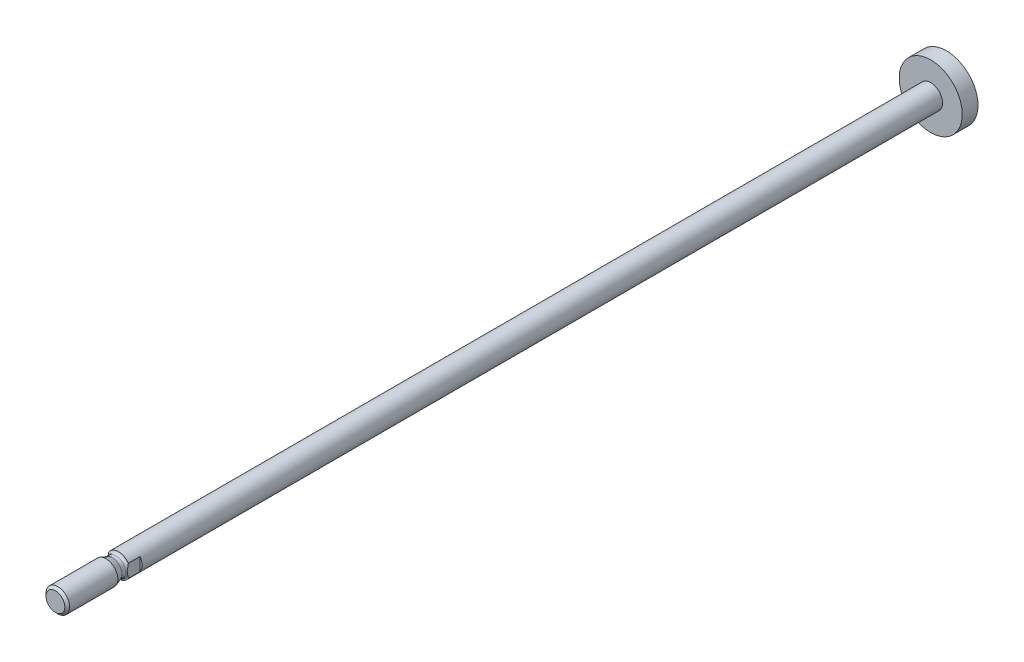
ISO-10303-21;
HEADER;
FILE_DESCRIPTION(('STEP AP214'),'2;1');
FILE_NAME('part.step','',(''),(''),'','','');
FILE_SCHEMA(('AUTOMOTIVE_DESIGN { 1 0 10303 214 1 1 1 1 }'));
ENDSEC;
DATA;
#1=APPLICATION_CONTEXT('core data for automotive mechanical design processes');
#2=APPLICATION_PROTOCOL_DEFINITION('international standard','automotive_design',2000,#1);
#3=PRODUCT_CONTEXT('',#1,'mechanical');
#4=PRODUCT('Part','Part','',(#3));
#5=PRODUCT_RELATED_PRODUCT_CATEGORY('part','',(#4));
#6=PRODUCT_DEFINITION_FORMATION('','',#4);
#7=PRODUCT_DEFINITION_CONTEXT('part definition',#1,'design');
#8=PRODUCT_DEFINITION('design','',#6,#7);
#9=PRODUCT_DEFINITION_SHAPE('','',#8);
#10=(LENGTH_UNIT() NAMED_UNIT(*) SI_UNIT(.MILLI.,.METRE.));
#11=(NAMED_UNIT(*) PLANE_ANGLE_UNIT() SI_UNIT($,.RADIAN.));
#12=(NAMED_UNIT(*) SI_UNIT($,.STERADIAN.) SOLID_ANGLE_UNIT());
#13=UNCERTAINTY_MEASURE_WITH_UNIT(LENGTH_MEASURE(1.E-05),#10,'distance_accuracy_value','');
#14=(GEOMETRIC_REPRESENTATION_CONTEXT(3) GLOBAL_UNCERTAINTY_ASSIGNED_CONTEXT((#13)) GLOBAL_UNIT_ASSIGNED_CONTEXT((#10,
#11,#12)) REPRESENTATION_CONTEXT('',''));
#15=CARTESIAN_POINT('',(0.,0.,0.));
#16=DIRECTION('',(0.,0.,1.));
#17=DIRECTION('',(1.,0.,0.));
#18=AXIS2_PLACEMENT_3D('',#15,#16,#17);
#19=CARTESIAN_POINT('',(0.,0.,-205.2));
#20=DIRECTION('',(0.,0.,1.));
#21=DIRECTION('',(1.,0.,0.));
#22=AXIS2_PLACEMENT_3D('',#19,#20,#21);
#23=CYLINDRICAL_SURFACE('',#22,3.);
#24=CARTESIAN_POINT('',(0.,0.,-201.2));
#25=DIRECTION('',(0.,0.,1.));
#26=DIRECTION('',(1.,0.,0.));
#27=AXIS2_PLACEMENT_3D('',#24,#25,#26);
#28=CIRCLE('',#27,3.);
#29=CARTESIAN_POINT('',(3.,0.,-201.2));
#30=VERTEX_POINT('',#29);
#31=EDGE_CURVE('E123',#30,#30,#28,.T.);
#32=ORIENTED_EDGE('',*,*,#31,.T.);
#33=EDGE_LOOP('',(#32));
#34=FACE_BOUND('',#33,.T.);
#35=DIRECTION('',(0.,0.,1.));
#36=VECTOR('',#35,1.);
#37=CARTESIAN_POINT('',(-2.5,-1.6583123951777,-205.2));
#38=LINE('',#37,#36);
#39=CARTESIAN_POINT('',(-2.5,-1.6583123951777,2.));
#40=VERTEX_POINT('',#39);
#41=CARTESIAN_POINT('',(-2.5,-1.6583123951777,5.));
#42=VERTEX_POINT('',#41);
#43=EDGE_CURVE('E53',#40,#42,#38,.T.);
#44=ORIENTED_EDGE('',*,*,#43,.F.);
#45=CARTESIAN_POINT('',(0.,0.,2.));
#46=DIRECTION('',(0.,0.,1.));
#47=DIRECTION('',(1.,0.,0.));
#48=AXIS2_PLACEMENT_3D('',#45,#46,#47);
#49=CIRCLE('',#48,3.);
#50=CARTESIAN_POINT('',(-2.5,1.6583123951777,2.));
#51=VERTEX_POINT('',#50);
#52=EDGE_CURVE('E11',#51,#40,#49,.T.);
#53=ORIENTED_EDGE('',*,*,#52,.F.);
#54=DIRECTION('',(0.,0.,1.));
#55=VECTOR('',#54,1.);
#56=CARTESIAN_POINT('',(-2.5,1.6583123951777,-205.2));
#57=LINE('',#56,#55);
#58=CARTESIAN_POINT('',(-2.5,1.65831239517778,4.99999999999909));
#59=VERTEX_POINT('',#58);
#60=EDGE_CURVE('E93',#59,#51,#57,.F.);
#61=ORIENTED_EDGE('',*,*,#60,.F.);
#62=CARTESIAN_POINT('',(0.,0.,5.));
#63=DIRECTION('',(0.,0.,1.));
#64=DIRECTION('',(1.,0.,0.));
#65=AXIS2_PLACEMENT_3D('',#62,#63,#64);
#66=CIRCLE('',#65,3.);
#67=CARTESIAN_POINT('',(2.5,1.6583123951777,5.));
#68=VERTEX_POINT('',#67);
#69=EDGE_CURVE('E92',#68,#59,#66,.T.);
#70=ORIENTED_EDGE('',*,*,#69,.F.);
#71=DIRECTION('',(0.,0.,1.));
#72=VECTOR('',#71,1.);
#73=CARTESIAN_POINT('',(2.5,1.6583123951777,-205.2));
#74=LINE('',#73,#72);
#75=CARTESIAN_POINT('',(2.5,1.6583123951777,2.));
#76=VERTEX_POINT('',#75);
#77=EDGE_CURVE('E61',#76,#68,#74,.T.);
#78=ORIENTED_EDGE('',*,*,#77,.F.);
#79=CARTESIAN_POINT('',(2.5,-1.6583123951777,2.));
#80=VERTEX_POINT('',#79);
#81=EDGE_CURVE('E42',#80,#76,#49,.T.);
#82=ORIENTED_EDGE('',*,*,#81,.F.);
#83=DIRECTION('',(0.,0.,1.));
#84=VECTOR('',#83,1.);
#85=CARTESIAN_POINT('',(2.5,-1.6583123951777,-205.2));
#86=LINE('',#85,#84);
#87=CARTESIAN_POINT('',(2.5,-1.65831239517778,4.99999999999909));
#88=VERTEX_POINT('',#87);
#89=EDGE_CURVE('E86',#88,#80,#86,.F.);
#90=ORIENTED_EDGE('',*,*,#89,.F.);
#91=EDGE_CURVE('E126',#42,#88,#66,.T.);
#92=ORIENTED_EDGE('',*,*,#91,.F.);
#93=EDGE_LOOP('',(#44,#53,#61,#70,#78,#82,#90,#92));
#94=FACE_BOUND('',#93,.T.);
#95=ADVANCED_FACE('F39',(#34,#94),#23,.T.);
#96=CARTESIAN_POINT('',(0.,0.,5.6000000000001));
#97=DIRECTION('',(0.,0.,1.));
#98=DIRECTION('',(1.,0.,0.));
#99=AXIS2_PLACEMENT_3D('',#96,#97,#98);
#100=TOROIDAL_SURFACE('',#99,3.0000000000001,0.600000000000099);
#101=CARTESIAN_POINT('',(0.,0.,5.6));
#102=DIRECTION('',(0.,0.,1.));
#103=DIRECTION('',(1.,0.,0.));
#104=AXIS2_PLACEMENT_3D('',#101,#102,#103);
#105=CIRCLE('',#104,2.4);
#106=CARTESIAN_POINT('',(2.4,0.,5.6));
#107=VERTEX_POINT('',#106);
#108=EDGE_CURVE('E114',#107,#107,#105,.T.);
#109=ORIENTED_EDGE('',*,*,#108,.F.);
#110=EDGE_LOOP('',(#109));
#111=FACE_BOUND('',#110,.T.);
#112=CARTESIAN_POINT('',(-2.5,0.,5.26833752096453));
#113=CARTESIAN_POINT('',(-2.5,0.0507234426297441,5.26834839993848));
#114=CARTESIAN_POINT('',(-2.5,0.101441776799662,5.26596843791489));
#115=CARTESIAN_POINT('',(-2.5,0.202536067556288,5.2569952015163));
#116=CARTESIAN_POINT('',(-2.5,0.252911588949165,5.2503973212644));
#117=CARTESIAN_POINT('',(-2.5,0.35392632203634,5.23403658213965));
#118=CARTESIAN_POINT('',(-2.5,0.404557369480025,5.224225913585));
#119=CARTESIAN_POINT('',(-2.5,0.505400398866161,5.20278595137819));
#120=CARTESIAN_POINT('',(-2.5,0.555612509775304,5.1911572409283));
#121=CARTESIAN_POINT('',(-2.5,0.655655613826413,5.16721678219831));
#122=CARTESIAN_POINT('',(-2.5,0.705487327239528,5.15490798008948));
#123=CARTESIAN_POINT('',(-2.5,0.805181864056362,5.13041893752706));
#124=CARTESIAN_POINT('',(-2.5,0.855044688832192,5.11823870324147));
#125=CARTESIAN_POINT('',(-2.5,1.00507376125951,5.08293674920261));
#126=CARTESIAN_POINT('',(-2.5,1.1055660279648,5.06108488117838));
#127=CARTESIAN_POINT('',(-2.5,1.30645493621981,5.02592717471424));
#128=CARTESIAN_POINT('',(-2.5,1.40682678389803,5.01248870030289));
#129=CARTESIAN_POINT('',(-2.5,1.60840199518987,4.99838763017595));
#130=CARTESIAN_POINT('',(-2.5,1.70960094347028,4.99767823287719));
#131=CARTESIAN_POINT('',(-2.5,1.86622781794818,5.01106448653587));
#132=CARTESIAN_POINT('',(-2.5,1.92218137883188,5.01877622049858));
#133=CARTESIAN_POINT('',(-2.5,2.03285053262341,5.0413651074687));
#134=CARTESIAN_POINT('',(-2.5,2.08756307823151,5.05625824117348));
#135=CARTESIAN_POINT('',(-2.5,2.18328084843635,5.09083457513036));
#136=CARTESIAN_POINT('',(-2.5,2.22483950461237,5.10896465354793));
#137=CARTESIAN_POINT('',(-2.5,2.30459524648064,5.1515245306446));
#138=CARTESIAN_POINT('',(-2.5,2.34279989724468,5.17593963670877));
#139=CARTESIAN_POINT('',(-2.5,2.40362753966407,5.22361594487622));
#140=CARTESIAN_POINT('',(-2.5,2.42757076392253,5.24518752529637));
#141=CARTESIAN_POINT('',(-2.5,2.47175757689057,5.29185573262645));
#142=CARTESIAN_POINT('',(-2.5,2.49200531158724,5.31694835263777));
#143=CARTESIAN_POINT('',(-2.5,2.52468492158815,5.36594738678137));
#144=CARTESIAN_POINT('',(-2.5,2.53785643218482,5.38935828111803));
#145=CARTESIAN_POINT('',(-2.5,2.56013164913301,5.43805384411947));
#146=CARTESIAN_POINT('',(-2.5,2.56923737677398,5.46333757440499));
#147=CARTESIAN_POINT('',(-2.5,2.58283057049981,5.51527496834575));
#148=CARTESIAN_POINT('',(-2.5,2.58729356105886,5.54193512227162));
#149=CARTESIAN_POINT('',(-2.5,2.59118020467599,5.59561989324821));
#150=CARTESIAN_POINT('',(-2.5,2.5906054179438,5.62264439487102));
#151=CARTESIAN_POINT('',(-2.5,2.5847447911938,5.67371298536964));
#152=CARTESIAN_POINT('',(-2.5,2.57988467167735,5.69780754958458));
#153=CARTESIAN_POINT('',(-2.5,2.56633022368149,5.74488485425705));
#154=CARTESIAN_POINT('',(-2.5,2.55763543991684,5.76786746233366));
#155=CARTESIAN_POINT('',(-2.5,2.53647695281551,5.81308697753744));
#156=CARTESIAN_POINT('',(-2.5,2.52388217742275,5.83526203314746));
#157=CARTESIAN_POINT('',(-2.5,2.49565831542702,5.87756858678122));
#158=CARTESIAN_POINT('',(-2.5,2.4800283022487,5.897699457906));
#159=CARTESIAN_POINT('',(-2.5,2.4381803160609,5.94494905141413));
#160=CARTESIAN_POINT('',(-2.5,2.41048793322772,5.97076525046522));
#161=CARTESIAN_POINT('',(-2.5,2.35128940318857,6.01762864695372));
#162=CARTESIAN_POINT('',(-2.5,2.31977194494069,6.03866114436212));
#163=CARTESIAN_POINT('',(-2.5,2.23952256294481,6.08463351159361));
#164=CARTESIAN_POINT('',(-2.5,2.18939204577726,6.10711912432076));
#165=CARTESIAN_POINT('',(-2.5,2.086424206848,6.14398267826286));
#166=CARTESIAN_POINT('',(-2.5,2.03358928965091,6.15836768991921));
#167=CARTESIAN_POINT('',(-2.5,1.93599580204544,6.17849484994285));
#168=CARTESIAN_POINT('',(-2.5,1.89144834077192,6.18531116329585));
#169=CARTESIAN_POINT('',(-2.5,1.80189908033616,6.19505697557448));
#170=CARTESIAN_POINT('',(-2.5,1.75689686177072,6.19798247787778));
#171=CARTESIAN_POINT('',(-2.5,1.66646832286127,6.20053377831371));
#172=CARTESIAN_POINT('',(-2.5,1.6210413945456,6.20013412759755));
#173=CARTESIAN_POINT('',(-2.5,1.53034280767568,6.19650595241103));
#174=CARTESIAN_POINT('',(-2.5,1.48507106445849,6.1932793543307));
#175=CARTESIAN_POINT('',(-2.5,1.33918047559004,6.17906735223514));
#176=CARTESIAN_POINT('',(-2.5,1.23902345631669,6.16342028964884));
#177=CARTESIAN_POINT('',(-2.5,1.03994836030368,6.12508984420092));
#178=CARTESIAN_POINT('',(-2.5,0.941034235224376,6.10238806221333));
#179=CARTESIAN_POINT('',(-2.5,0.793509038998567,6.06677672186832));
#180=CARTESIAN_POINT('',(-2.5,0.7446863854637,6.054702575567));
#181=CARTESIAN_POINT('',(-2.5,0.646996290398524,6.030738686552));
#182=CARTESIAN_POINT('',(-2.5,0.598128851070118,6.0188489352388));
#183=CARTESIAN_POINT('',(-2.5,0.500334281886721,5.99617397742217));
#184=CARTESIAN_POINT('',(-2.5,0.451408146263369,5.98538460255591));
#185=CARTESIAN_POINT('',(-2.5,0.353119090508098,5.96594052833405));
#186=CARTESIAN_POINT('',(-2.5,0.303756196305667,5.95728570312374));
#187=CARTESIAN_POINT('',(-2.5,0.204122497966492,5.94328110899502));
#188=CARTESIAN_POINT('',(-2.5,0.153847567097064,5.93795905985694));
#189=CARTESIAN_POINT('',(-2.5,0.0530351286873156,5.93177082830429));
#190=CARTESIAN_POINT('',(-2.5,0.0024977994589948,5.930901937583));
#191=CARTESIAN_POINT('',(-2.5,-0.0985305210715612,5.93381110626722));
#192=CARTESIAN_POINT('',(-2.5,-0.14902123482016,5.93759813511376));
#193=CARTESIAN_POINT('',(-2.5,-0.249573888409545,5.94904126176878));
#194=CARTESIAN_POINT('',(-2.5,-0.299635458091892,5.95670041313862));
#195=CARTESIAN_POINT('',(-2.5,-0.399725252919972,5.97472154484855));
#196=CARTESIAN_POINT('',(-2.5,-0.449748880216866,5.98510788708088));
#197=CARTESIAN_POINT('',(-2.5,-0.549453617514231,6.00732659888942));
#198=CARTESIAN_POINT('',(-2.5,-0.599134785603654,6.01915871651809));
#199=CARTESIAN_POINT('',(-2.5,-0.698392421521691,6.04328051823731));
#200=CARTESIAN_POINT('',(-2.5,-0.747968869022546,6.05557028383309));
#201=CARTESIAN_POINT('',(-2.5,-0.84720464589227,6.07981009984425));
#202=CARTESIAN_POINT('',(-2.5,-0.896863971124109,6.0917601667094));
#203=CARTESIAN_POINT('',(-2.5,-0.975241469303783,6.10978478042876));
#204=CARTESIAN_POINT('',(-2.5,-1.00388150216564,6.11619624816889));
#205=CARTESIAN_POINT('',(-2.5,-1.06125902675178,6.12857195456169));
#206=CARTESIAN_POINT('',(-2.5,-1.08999652018277,6.13453618533974));
#207=CARTESIAN_POINT('',(-2.5,-1.14748265723325,6.1458846074232));
#208=CARTESIAN_POINT('',(-2.5,-1.17623091126653,6.15127075206469));
#209=CARTESIAN_POINT('',(-2.5,-1.23384312688132,6.16137594760793));
#210=CARTESIAN_POINT('',(-2.5,-1.26270708577413,6.16609501391968));
#211=CARTESIAN_POINT('',(-2.5,-1.34949136584038,6.17908804539659));
#212=CARTESIAN_POINT('',(-2.5,-1.40759592627029,6.18619616796949));
#213=CARTESIAN_POINT('',(-2.5,-1.52420669712544,6.19636423685649));
#214=CARTESIAN_POINT('',(-2.5,-1.58271310503325,6.1994220245478));
#215=CARTESIAN_POINT('',(-2.5,-1.70911532678372,6.20051114496721));
#216=CARTESIAN_POINT('',(-2.5,-1.77702602049488,6.19766666103081));
#217=CARTESIAN_POINT('',(-2.5,-1.912149147007,6.18315262249392));
#218=CARTESIAN_POINT('',(-2.5,-1.97936016975703,6.17146782027944));
#219=CARTESIAN_POINT('',(-2.5,-2.09293467910467,6.14162835403314));
#220=CARTESIAN_POINT('',(-2.5,-2.1399801193776,6.12611102431254));
#221=CARTESIAN_POINT('',(-2.5,-2.23116163556241,6.08815370009842));
#222=CARTESIAN_POINT('',(-2.5,-2.27530548479003,6.06573319994486));
#223=CARTESIAN_POINT('',(-2.5,-2.34660579555824,6.0206656653127));
#224=CARTESIAN_POINT('',(-2.5,-2.37498330055351,5.99995880382842));
#225=CARTESIAN_POINT('',(-2.5,-2.42818185419372,5.95435228802646));
#226=CARTESIAN_POINT('',(-2.5,-2.45300628498281,5.92945667074117));
#227=CARTESIAN_POINT('',(-2.5,-2.49337206402375,5.88080957286876));
#228=CARTESIAN_POINT('',(-2.5,-2.50977972671913,5.85778028891266));
#229=CARTESIAN_POINT('',(-2.5,-2.5385948801776,5.80932543735906));
#230=CARTESIAN_POINT('',(-2.5,-2.55100468980703,5.7839012699618));
#231=CARTESIAN_POINT('',(-2.5,-2.57111606880391,5.7310152189761));
#232=CARTESIAN_POINT('',(-2.5,-2.57878240755407,5.70353974708557));
#233=CARTESIAN_POINT('',(-2.5,-2.58865812747843,5.64762323062993));
#234=CARTESIAN_POINT('',(-2.5,-2.59087093912576,5.61918280447873));
#235=CARTESIAN_POINT('',(-2.5,-2.58974032110845,5.56589468768046));
#236=CARTESIAN_POINT('',(-2.5,-2.58704036062141,5.54103102121321));
#237=CARTESIAN_POINT('',(-2.5,-2.57748265423562,5.49212434637714));
#238=CARTESIAN_POINT('',(-2.5,-2.57062518368025,5.46808128377277));
#239=CARTESIAN_POINT('',(-2.5,-2.55318309970271,5.42147694109437));
#240=CARTESIAN_POINT('',(-2.5,-2.54260847384664,5.39891188066154));
#241=CARTESIAN_POINT('',(-2.5,-2.51826231502416,5.35558968714916));
#242=CARTESIAN_POINT('',(-2.5,-2.50448933519591,5.33483337816906));
#243=CARTESIAN_POINT('',(-2.5,-2.46797257111134,5.28708275256527));
#244=CARTESIAN_POINT('',(-2.5,-2.44388663659998,5.26111270404154));
#245=CARTESIAN_POINT('',(-2.5,-2.39183121173732,5.21341702762138));
#246=CARTESIAN_POINT('',(-2.5,-2.36385414462067,5.19169988455002));
#247=CARTESIAN_POINT('',(-2.5,-2.29309604385226,5.14424955817408));
#248=CARTESIAN_POINT('',(-2.5,-2.24896151787955,5.12054273771195));
#249=CARTESIAN_POINT('',(-2.5,-2.15755724893995,5.08032986787273));
#250=CARTESIAN_POINT('',(-2.5,-2.1102815253453,5.0638380357592));
#251=CARTESIAN_POINT('',(-2.5,-1.98539576167196,5.02901994971649));
#252=CARTESIAN_POINT('',(-2.5,-1.90647682078743,5.01544295171964));
#253=CARTESIAN_POINT('',(-2.5,-1.74768813149434,5.00017484346382));
#254=CARTESIAN_POINT('',(-2.5,-1.66781762927049,4.99849388464395));
#255=CARTESIAN_POINT('',(-2.5,-1.45429321635247,5.00579419289827));
#256=CARTESIAN_POINT('',(-2.5,-1.32097329964418,5.02279704607492));
#257=CARTESIAN_POINT('',(-2.5,-1.12273292987174,5.05843900515103));
#258=CARTESIAN_POINT('',(-2.5,-1.05669317759064,5.07208123732001));
#259=CARTESIAN_POINT('',(-2.5,-0.925080173294097,5.10144856377507));
#260=CARTESIAN_POINT('',(-2.5,-0.85950678696237,5.11717303045709));
#261=CARTESIAN_POINT('',(-2.5,-0.728157455724953,5.14928145287764));
#262=CARTESIAN_POINT('',(-2.5,-0.662382356378558,5.16566853749943));
#263=CARTESIAN_POINT('',(-2.5,-0.530451230737349,5.19710748690057));
#264=CARTESIAN_POINT('',(-2.5,-0.46429498692756,5.21215848739435));
#265=CARTESIAN_POINT('',(-2.5,-0.332137198799993,5.23811298682939));
#266=CARTESIAN_POINT('',(-2.5,-0.266147995614798,5.24907485812429));
#267=CARTESIAN_POINT('',(-2.5,-0.13343508853748,5.26417313941374));
#268=CARTESIAN_POINT('',(-2.5,-0.0667131258677896,5.26832321258322));
#269=CARTESIAN_POINT('',(-2.5,0.,5.26833752096453));
#270=B_SPLINE_CURVE_WITH_KNOTS('',3,(#112,#113,#114,#115,#116,#117,#118,#119,#120,#121,#122,
#123,#124,#125,#126,#127,#128,#129,#130,#131,#132,#133,#134,#135,#136,#137,#138,#139,#140,#141,
#142,#143,#144,#145,#146,#147,#148,#149,#150,#151,#152,#153,#154,#155,#156,#157,#158,#159,#160,
#161,#162,#163,#164,#165,#166,#167,#168,#169,#170,#171,#172,#173,#174,#175,#176,#177,#178,#179,
#180,#181,#182,#183,#184,#185,#186,#187,#188,#189,#190,#191,#192,#193,#194,#195,#196,#197,#198,
#199,#200,#201,#202,#203,#204,#205,#206,#207,#208,#209,#210,#211,#212,#213,#214,#215,#216,#217,
#218,#219,#220,#221,#222,#223,#224,#225,#226,#227,#228,#229,#230,#231,#232,#233,#234,#235,#236,
#237,#238,#239,#240,#241,#242,#243,#244,#245,#246,#247,#248,#249,#250,#251,#252,#253,#254,#255,
#256,#257,#258,#259,#260,#261,#262,#263,#264,#265,#266,#267,#268,#269),.UNSPECIFIED.,.T.,.F.,(4,
2,2,2,2,2,2,2,2,2,2,2,2,2,2,2,2,2,2,2,2,2,2,2,2,2,2,2,2,2,2,2,2,2,2,2,2,2,2,2,2,2,2,2,2,2,2,2,2,
2,2,2,2,2,2,2,2,2,2,2,2,2,2,2,2,2,2,2,2,2,2,2,2,2,2,2,2,2,4),(0.,0.152115749462961,
0.304397890479205,0.459057777660119,0.613668153537359,0.76765452052503,0.921648241698668,
1.22999186740174,1.53334327295527,1.83557910296654,2.00468122496769,2.17416139710525,
2.30975526259906,2.44503498191611,2.54138706790922,2.63763038250484,2.71788414225495,
2.79809795959123,2.87873253660465,2.95934214181033,3.03274594433316,3.10615846435156,
3.18237030946167,3.25860545664829,3.37154774885102,3.48483255287211,3.64874326809032,
3.81251069461259,3.94751849926572,4.08266487644991,4.21884653384819,4.35493546397263,
4.65852821936571,4.96291950372185,5.11380283698696,5.2646791123006,5.41496078164642,
5.56523358814694,5.71674021710462,5.86815469233289,6.01986131905259,6.17168776888823,
6.3249195654772,6.47812469716163,6.63135724578266,6.7845823615018,6.87262624262423,
6.9606716735928,7.04840955727845,7.13614541382411,7.31164210225534,7.487232283928,
7.69072100095721,7.89456149389004,8.04275027379228,8.1905243529531,8.29556794817655,
8.40051087855684,8.48500651711341,8.56945305722983,8.65451949621374,8.73953241154295,
8.81419843639983,8.88885951681877,8.96332150589878,9.03781724571823,9.14348655987521,
9.24936459025057,9.39882327642183,9.54857516145059,9.78744806917548,10.0265247936209,
10.4280628477144,10.630387719692,10.8326517473681,11.0360188284461,11.239516519211,
11.439986712254,11.6400543065313),.UNSPECIFIED.);
#271=EDGE_CURVE('E84',#42,#59,#270,.T.);
#272=ORIENTED_EDGE('',*,*,#271,.F.);
#273=ORIENTED_EDGE('',*,*,#91,.T.);
#274=CARTESIAN_POINT('',(2.5,0.,5.26833752096453));
#275=CARTESIAN_POINT('',(2.5,-0.0507234426297441,5.26834839993848));
#276=CARTESIAN_POINT('',(2.5,-0.101441776799662,5.26596843791489));
#277=CARTESIAN_POINT('',(2.5,-0.202536067556288,5.2569952015163));
#278=CARTESIAN_POINT('',(2.5,-0.252911588949165,5.2503973212644));
#279=CARTESIAN_POINT('',(2.5,-0.35392632203634,5.23403658213965));
#280=CARTESIAN_POINT('',(2.5,-0.404557369480025,5.224225913585));
#281=CARTESIAN_POINT('',(2.5,-0.505400398866161,5.20278595137819));
#282=CARTESIAN_POINT('',(2.5,-0.555612509775304,5.1911572409283));
#283=CARTESIAN_POINT('',(2.5,-0.655655613826413,5.16721678219831));
#284=CARTESIAN_POINT('',(2.5,-0.705487327239528,5.15490798008948));
#285=CARTESIAN_POINT('',(2.5,-0.805181864056362,5.13041893752706));
#286=CARTESIAN_POINT('',(2.5,-0.855044688832192,5.11823870324147));
#287=CARTESIAN_POINT('',(2.5,-1.00507376125951,5.08293674920261));
#288=CARTESIAN_POINT('',(2.5,-1.1055660279648,5.06108488117838));
#289=CARTESIAN_POINT('',(2.5,-1.30645493621981,5.02592717471424));
#290=CARTESIAN_POINT('',(2.5,-1.40682678389803,5.01248870030289));
#291=CARTESIAN_POINT('',(2.5,-1.60840199518987,4.99838763017595));
#292=CARTESIAN_POINT('',(2.5,-1.70960094347028,4.99767823287719));
#293=CARTESIAN_POINT('',(2.5,-1.86622781794818,5.01106448653587));
#294=CARTESIAN_POINT('',(2.5,-1.92218137883188,5.01877622049858));
#295=CARTESIAN_POINT('',(2.5,-2.03285053262341,5.0413651074687));
#296=CARTESIAN_POINT('',(2.5,-2.08756307823151,5.05625824117348));
#297=CARTESIAN_POINT('',(2.5,-2.18328084843635,5.09083457513036));
#298=CARTESIAN_POINT('',(2.5,-2.22483950461237,5.10896465354793));
#299=CARTESIAN_POINT('',(2.5,-2.30459524648064,5.1515245306446));
#300=CARTESIAN_POINT('',(2.5,-2.34279989724468,5.17593963670877));
#301=CARTESIAN_POINT('',(2.5,-2.40362753966407,5.22361594487622));
#302=CARTESIAN_POINT('',(2.5,-2.42757076392253,5.24518752529637));
#303=CARTESIAN_POINT('',(2.5,-2.47175757689057,5.29185573262645));
#304=CARTESIAN_POINT('',(2.5,-2.49200531158724,5.31694835263777));
#305=CARTESIAN_POINT('',(2.5,-2.52468492158815,5.36594738678137));
#306=CARTESIAN_POINT('',(2.5,-2.53785643218482,5.38935828111803));
#307=CARTESIAN_POINT('',(2.5,-2.56013164913301,5.43805384411947));
#308=CARTESIAN_POINT('',(2.5,-2.56923737677398,5.46333757440499));
#309=CARTESIAN_POINT('',(2.5,-2.58283057049981,5.51527496834575));
#310=CARTESIAN_POINT('',(2.5,-2.58729356105886,5.54193512227162));
#311=CARTESIAN_POINT('',(2.5,-2.59118020467599,5.59561989324821));
#312=CARTESIAN_POINT('',(2.5,-2.5906054179438,5.62264439487102));
#313=CARTESIAN_POINT('',(2.5,-2.5847447911938,5.67371298536964));
#314=CARTESIAN_POINT('',(2.5,-2.57988467167735,5.69780754958458));
#315=CARTESIAN_POINT('',(2.5,-2.56633022368149,5.74488485425705));
#316=CARTESIAN_POINT('',(2.5,-2.55763543991684,5.76786746233366));
#317=CARTESIAN_POINT('',(2.5,-2.53647695281551,5.81308697753744));
#318=CARTESIAN_POINT('',(2.5,-2.52388217742275,5.83526203314746));
#319=CARTESIAN_POINT('',(2.5,-2.49565831542702,5.87756858678122));
#320=CARTESIAN_POINT('',(2.5,-2.4800283022487,5.897699457906));
#321=CARTESIAN_POINT('',(2.5,-2.4381803160609,5.94494905141413));
#322=CARTESIAN_POINT('',(2.5,-2.41048793322772,5.97076525046522));
#323=CARTESIAN_POINT('',(2.5,-2.35128940318857,6.01762864695372));
#324=CARTESIAN_POINT('',(2.5,-2.31977194494069,6.03866114436212));
#325=CARTESIAN_POINT('',(2.5,-2.23952256294481,6.08463351159361));
#326=CARTESIAN_POINT('',(2.5,-2.18939204577726,6.10711912432076));
#327=CARTESIAN_POINT('',(2.5,-2.086424206848,6.14398267826286));
#328=CARTESIAN_POINT('',(2.5,-2.03358928965091,6.15836768991921));
#329=CARTESIAN_POINT('',(2.5,-1.93599580204544,6.17849484994285));
#330=CARTESIAN_POINT('',(2.5,-1.89144834077192,6.18531116329585));
#331=CARTESIAN_POINT('',(2.5,-1.80189908033616,6.19505697557448));
#332=CARTESIAN_POINT('',(2.5,-1.75689686177072,6.19798247787778));
#333=CARTESIAN_POINT('',(2.5,-1.66646832286127,6.20053377831371));
#334=CARTESIAN_POINT('',(2.5,-1.6210413945456,6.20013412759755));
#335=CARTESIAN_POINT('',(2.5,-1.53034280767568,6.19650595241103));
#336=CARTESIAN_POINT('',(2.5,-1.48507106445849,6.1932793543307));
#337=CARTESIAN_POINT('',(2.5,-1.33918047559004,6.17906735223514));
#338=CARTESIAN_POINT('',(2.5,-1.23902345631669,6.16342028964884));
#339=CARTESIAN_POINT('',(2.5,-1.03994836030368,6.12508984420092));
#340=CARTESIAN_POINT('',(2.5,-0.941034235224376,6.10238806221333));
#341=CARTESIAN_POINT('',(2.5,-0.793509038998567,6.06677672186832));
#342=CARTESIAN_POINT('',(2.5,-0.7446863854637,6.054702575567));
#343=CARTESIAN_POINT('',(2.5,-0.646996290398524,6.030738686552));
#344=CARTESIAN_POINT('',(2.5,-0.598128851070118,6.0188489352388));
#345=CARTESIAN_POINT('',(2.5,-0.500334281886721,5.99617397742217));
#346=CARTESIAN_POINT('',(2.5,-0.451408146263369,5.98538460255591));
#347=CARTESIAN_POINT('',(2.5,-0.353119090508098,5.96594052833405));
#348=CARTESIAN_POINT('',(2.5,-0.303756196305667,5.95728570312374));
#349=CARTESIAN_POINT('',(2.5,-0.204122497966492,5.94328110899502));
#350=CARTESIAN_POINT('',(2.5,-0.153847567097064,5.93795905985694));
#351=CARTESIAN_POINT('',(2.5,-0.0530351286873156,5.93177082830429));
#352=CARTESIAN_POINT('',(2.5,-0.0024977994589948,5.930901937583));
#353=CARTESIAN_POINT('',(2.5,0.0985305210715612,5.93381110626722));
#354=CARTESIAN_POINT('',(2.5,0.14902123482016,5.93759813511376));
#355=CARTESIAN_POINT('',(2.5,0.249573888409545,5.94904126176878));
#356=CARTESIAN_POINT('',(2.5,0.299635458091892,5.95670041313862));
#357=CARTESIAN_POINT('',(2.5,0.399725252919972,5.97472154484855));
#358=CARTESIAN_POINT('',(2.5,0.449748880216866,5.98510788708088));
#359=CARTESIAN_POINT('',(2.5,0.549453617514231,6.00732659888942));
#360=CARTESIAN_POINT('',(2.5,0.599134785603654,6.01915871651809));
#361=CARTESIAN_POINT('',(2.5,0.698392421521691,6.04328051823731));
#362=CARTESIAN_POINT('',(2.5,0.747968869022546,6.05557028383309));
#363=CARTESIAN_POINT('',(2.5,0.84720464589227,6.07981009984425));
#364=CARTESIAN_POINT('',(2.5,0.896863971124109,6.0917601667094));
#365=CARTESIAN_POINT('',(2.5,0.975241469303783,6.10978478042876));
#366=CARTESIAN_POINT('',(2.5,1.00388150216564,6.11619624816889));
#367=CARTESIAN_POINT('',(2.5,1.06125902675178,6.12857195456169));
#368=CARTESIAN_POINT('',(2.5,1.08999652018277,6.13453618533974));
#369=CARTESIAN_POINT('',(2.5,1.14748265723325,6.1458846074232));
#370=CARTESIAN_POINT('',(2.5,1.17623091126653,6.15127075206469));
#371=CARTESIAN_POINT('',(2.5,1.23384312688132,6.16137594760793));
#372=CARTESIAN_POINT('',(2.5,1.26270708577413,6.16609501391968));
#373=CARTESIAN_POINT('',(2.5,1.34949136584038,6.17908804539659));
#374=CARTESIAN_POINT('',(2.5,1.40759592627029,6.18619616796949));
#375=CARTESIAN_POINT('',(2.5,1.52420669712544,6.19636423685649));
#376=CARTESIAN_POINT('',(2.5,1.58271310503325,6.1994220245478));
#377=CARTESIAN_POINT('',(2.5,1.70911532678372,6.20051114496721));
#378=CARTESIAN_POINT('',(2.5,1.77702602049488,6.19766666103081));
#379=CARTESIAN_POINT('',(2.5,1.912149147007,6.18315262249392));
#380=CARTESIAN_POINT('',(2.5,1.97936016975703,6.17146782027944));
#381=CARTESIAN_POINT('',(2.5,2.09293467910467,6.14162835403314));
#382=CARTESIAN_POINT('',(2.5,2.1399801193776,6.12611102431254));
#383=CARTESIAN_POINT('',(2.5,2.23116163556241,6.08815370009842));
#384=CARTESIAN_POINT('',(2.5,2.27530548479003,6.06573319994486));
#385=CARTESIAN_POINT('',(2.5,2.34660579555824,6.0206656653127));
#386=CARTESIAN_POINT('',(2.5,2.37498330055351,5.99995880382842));
#387=CARTESIAN_POINT('',(2.5,2.42818185419372,5.95435228802646));
#388=CARTESIAN_POINT('',(2.5,2.45300628498281,5.92945667074117));
#389=CARTESIAN_POINT('',(2.5,2.49337206402375,5.88080957286876));
#390=CARTESIAN_POINT('',(2.5,2.50977972671913,5.85778028891266));
#391=CARTESIAN_POINT('',(2.5,2.5385948801776,5.80932543735906));
#392=CARTESIAN_POINT('',(2.5,2.55100468980703,5.7839012699618));
#393=CARTESIAN_POINT('',(2.5,2.57111606880391,5.7310152189761));
#394=CARTESIAN_POINT('',(2.5,2.57878240755407,5.70353974708557));
#395=CARTESIAN_POINT('',(2.5,2.58865812747843,5.64762323062993));
#396=CARTESIAN_POINT('',(2.5,2.59087093912576,5.61918280447873));
#397=CARTESIAN_POINT('',(2.5,2.58974032110845,5.56589468768046));
#398=CARTESIAN_POINT('',(2.5,2.58704036062141,5.54103102121321));
#399=CARTESIAN_POINT('',(2.5,2.57748265423562,5.49212434637714));
#400=CARTESIAN_POINT('',(2.5,2.57062518368025,5.46808128377277));
#401=CARTESIAN_POINT('',(2.5,2.55318309970271,5.42147694109437));
#402=CARTESIAN_POINT('',(2.5,2.54260847384664,5.39891188066154));
#403=CARTESIAN_POINT('',(2.5,2.51826231502416,5.35558968714916));
#404=CARTESIAN_POINT('',(2.5,2.50448933519591,5.33483337816906));
#405=CARTESIAN_POINT('',(2.5,2.46797257111134,5.28708275256527));
#406=CARTESIAN_POINT('',(2.5,2.44388663659998,5.26111270404154));
#407=CARTESIAN_POINT('',(2.5,2.39183121173732,5.21341702762138));
#408=CARTESIAN_POINT('',(2.5,2.36385414462067,5.19169988455002));
#409=CARTESIAN_POINT('',(2.5,2.29309604385226,5.14424955817408));
#410=CARTESIAN_POINT('',(2.5,2.24896151787955,5.12054273771195));
#411=CARTESIAN_POINT('',(2.5,2.15755724893995,5.08032986787273));
#412=CARTESIAN_POINT('',(2.5,2.1102815253453,5.0638380357592));
#413=CARTESIAN_POINT('',(2.5,1.98539576167196,5.02901994971649));
#414=CARTESIAN_POINT('',(2.5,1.90647682078743,5.01544295171964));
#415=CARTESIAN_POINT('',(2.5,1.74768813149434,5.00017484346382));
#416=CARTESIAN_POINT('',(2.5,1.66781762927049,4.99849388464395));
#417=CARTESIAN_POINT('',(2.5,1.45429321635247,5.00579419289827));
#418=CARTESIAN_POINT('',(2.5,1.32097329964418,5.02279704607492));
#419=CARTESIAN_POINT('',(2.5,1.12273292987174,5.05843900515103));
#420=CARTESIAN_POINT('',(2.5,1.05669317759064,5.07208123732001));
#421=CARTESIAN_POINT('',(2.5,0.925080173294097,5.10144856377507));
#422=CARTESIAN_POINT('',(2.5,0.85950678696237,5.11717303045709));
#423=CARTESIAN_POINT('',(2.5,0.728157455724953,5.14928145287764));
#424=CARTESIAN_POINT('',(2.5,0.662382356378558,5.16566853749943));
#425=CARTESIAN_POINT('',(2.5,0.530451230737349,5.19710748690057));
#426=CARTESIAN_POINT('',(2.5,0.46429498692756,5.21215848739435));
#427=CARTESIAN_POINT('',(2.5,0.332137198799993,5.23811298682939));
#428=CARTESIAN_POINT('',(2.5,0.266147995614798,5.24907485812429));
#429=CARTESIAN_POINT('',(2.5,0.13343508853748,5.26417313941374));
#430=CARTESIAN_POINT('',(2.5,0.0667131258677896,5.26832321258322));
#431=CARTESIAN_POINT('',(2.5,0.,5.26833752096453));
#432=B_SPLINE_CURVE_WITH_KNOTS('',3,(#274,#275,#276,#277,#278,#279,#280,#281,#282,#283,#284,
#285,#286,#287,#288,#289,#290,#291,#292,#293,#294,#295,#296,#297,#298,#299,#300,#301,#302,#303,
#304,#305,#306,#307,#308,#309,#310,#311,#312,#313,#314,#315,#316,#317,#318,#319,#320,#321,#322,
#323,#324,#325,#326,#327,#328,#329,#330,#331,#332,#333,#334,#335,#336,#337,#338,#339,#340,#341,
#342,#343,#344,#345,#346,#347,#348,#349,#350,#351,#352,#353,#354,#355,#356,#357,#358,#359,#360,
#361,#362,#363,#364,#365,#366,#367,#368,#369,#370,#371,#372,#373,#374,#375,#376,#377,#378,#379,
#380,#381,#382,#383,#384,#385,#386,#387,#388,#389,#390,#391,#392,#393,#394,#395,#396,#397,#398,
#399,#400,#401,#402,#403,#404,#405,#406,#407,#408,#409,#410,#411,#412,#413,#414,#415,#416,#417,
#418,#419,#420,#421,#422,#423,#424,#425,#426,#427,#428,#429,#430,#431),.UNSPECIFIED.,.T.,.F.,(4,
2,2,2,2,2,2,2,2,2,2,2,2,2,2,2,2,2,2,2,2,2,2,2,2,2,2,2,2,2,2,2,2,2,2,2,2,2,2,2,2,2,2,2,2,2,2,2,2,
2,2,2,2,2,2,2,2,2,2,2,2,2,2,2,2,2,2,2,2,2,2,2,2,2,2,2,2,2,4),(0.,0.152115749462961,
0.304397890479205,0.459057777660119,0.613668153537359,0.76765452052503,0.921648241698668,
1.22999186740174,1.53334327295527,1.83557910296654,2.00468122496769,2.17416139710525,
2.30975526259906,2.44503498191611,2.54138706790922,2.63763038250484,2.71788414225495,
2.79809795959123,2.87873253660465,2.95934214181033,3.03274594433316,3.10615846435156,
3.18237030946167,3.25860545664829,3.37154774885102,3.48483255287211,3.64874326809032,
3.81251069461259,3.94751849926572,4.08266487644991,4.21884653384819,4.35493546397263,
4.65852821936571,4.96291950372185,5.11380283698696,5.2646791123006,5.41496078164642,
5.56523358814694,5.71674021710462,5.86815469233289,6.01986131905259,6.17168776888823,
6.3249195654772,6.47812469716163,6.63135724578266,6.7845823615018,6.87262624262423,
6.9606716735928,7.04840955727845,7.13614541382411,7.31164210225534,7.487232283928,
7.69072100095721,7.89456149389004,8.04275027379228,8.1905243529531,8.29556794817655,
8.40051087855684,8.48500651711341,8.56945305722983,8.65451949621374,8.73953241154295,
8.81419843639983,8.88885951681877,8.96332150589878,9.03781724571823,9.14348655987521,
9.24936459025057,9.39882327642183,9.54857516145059,9.78744806917548,10.0265247936209,
10.4280628477144,10.630387719692,10.8326517473681,11.0360188284461,11.239516519211,
11.439986712254,11.6400543065313),.UNSPECIFIED.);
#433=EDGE_CURVE('E128',#68,#88,#432,.T.);
#434=ORIENTED_EDGE('',*,*,#433,.F.);
#435=ORIENTED_EDGE('',*,*,#69,.T.);
#436=EDGE_LOOP('',(#272,#273,#434,#435));
#437=FACE_BOUND('',#436,.T.);
#438=ADVANCED_FACE('F138',(#111,#437),#100,.F.);
#439=CARTESIAN_POINT('',(0.,3.,-201.2));
#440=DIRECTION('',(0.,0.,-1.));
#441=DIRECTION('',(-1.,0.,0.));
#442=AXIS2_PLACEMENT_3D('',#439,#440,#441);
#443=PLANE('',#442);
#444=ORIENTED_EDGE('',*,*,#31,.F.);
#445=EDGE_LOOP('',(#444));
#446=FACE_BOUND('',#445,.T.);
#447=CARTESIAN_POINT('',(0.,0.,-201.2));
#448=DIRECTION('',(0.,0.,1.));
#449=DIRECTION('',(1.,0.,0.));
#450=AXIS2_PLACEMENT_3D('',#447,#448,#449);
#451=CIRCLE('',#450,8.);
#452=CARTESIAN_POINT('',(8.,0.,-201.2));
#453=VERTEX_POINT('',#452);
#454=EDGE_CURVE('E120',#453,#453,#451,.T.);
#455=ORIENTED_EDGE('',*,*,#454,.T.);
#456=EDGE_LOOP('',(#455));
#457=FACE_BOUND('',#456,.T.);
#458=ADVANCED_FACE('F185',(#446,#457),#443,.F.);
#459=CARTESIAN_POINT('',(0.,0.,-205.2));
#460=DIRECTION('',(0.,0.,1.));
#461=DIRECTION('',(1.,0.,0.));
#462=AXIS2_PLACEMENT_3D('',#459,#460,#461);
#463=CYLINDRICAL_SURFACE('',#462,8.);
#464=ORIENTED_EDGE('',*,*,#454,.F.);
#465=EDGE_LOOP('',(#464));
#466=FACE_BOUND('',#465,.T.);
#467=CARTESIAN_POINT('',(0.,0.,-205.2));
#468=DIRECTION('',(0.,0.,1.));
#469=DIRECTION('',(1.,0.,0.));
#470=AXIS2_PLACEMENT_3D('',#467,#468,#469);
#471=CIRCLE('',#470,8.);
#472=CARTESIAN_POINT('',(8.,0.,-205.2));
#473=VERTEX_POINT('',#472);
#474=EDGE_CURVE('E117',#473,#473,#471,.T.);
#475=ORIENTED_EDGE('',*,*,#474,.T.);
#476=EDGE_LOOP('',(#475));
#477=FACE_BOUND('',#476,.T.);
#478=ADVANCED_FACE('F176',(#466,#477),#463,.T.);
#479=CARTESIAN_POINT('',(0.,8.,-205.2));
#480=DIRECTION('',(0.,0.,1.));
#481=DIRECTION('',(1.,0.,0.));
#482=AXIS2_PLACEMENT_3D('',#479,#480,#481);
#483=PLANE('',#482);
#484=ORIENTED_EDGE('',*,*,#474,.F.);
#485=EDGE_LOOP('',(#484));
#486=FACE_BOUND('',#485,.T.);
#487=ADVANCED_FACE('F171',(#486),#483,.F.);
#488=CARTESIAN_POINT('',(0.,0.,4.));
#489=DIRECTION('',(0.,0.,1.));
#490=DIRECTION('',(1.,0.,0.));
#491=AXIS2_PLACEMENT_3D('',#488,#489,#490);
#492=CYLINDRICAL_SURFACE('',#491,2.4);
#493=CARTESIAN_POINT('',(0.,0.,6.3942038115749));
#494=DIRECTION('',(0.,0.,1.));
#495=DIRECTION('',(1.,0.,0.));
#496=AXIS2_PLACEMENT_3D('',#493,#494,#495);
#497=CIRCLE('',#496,2.4);
#498=CARTESIAN_POINT('',(2.4,0.,6.3942038115749));
#499=VERTEX_POINT('',#498);
#500=EDGE_CURVE('E111',#499,#499,#497,.T.);
#501=ORIENTED_EDGE('',*,*,#500,.F.);
#502=EDGE_LOOP('',(#501));
#503=FACE_BOUND('',#502,.T.);
#504=ORIENTED_EDGE('',*,*,#108,.T.);
#505=EDGE_LOOP('',(#504));
#506=FACE_BOUND('',#505,.T.);
#507=ADVANCED_FACE('F168',(#503,#506),#492,.T.);
#508=CARTESIAN_POINT('',(0.,0.,6.39420381157482));
#509=DIRECTION('',(0.,0.,1.));
#510=DIRECTION('',(1.,0.,0.));
#511=AXIS2_PLACEMENT_3D('',#508,#509,#510);
#512=TOROIDAL_SURFACE('',#511,2.99999999999972,0.599999999999719);
#513=CARTESIAN_POINT('',(0.,0.,6.5994158975703));
#514=DIRECTION('',(0.,0.,1.));
#515=DIRECTION('',(1.,0.,0.));
#516=AXIS2_PLACEMENT_3D('',#513,#514,#515);
#517=CIRCLE('',#516,2.4361844275285);
#518=CARTESIAN_POINT('',(2.4361844275285,0.,6.5994158975703));
#519=VERTEX_POINT('',#518);
#520=EDGE_CURVE('E108',#519,#519,#517,.T.);
#521=ORIENTED_EDGE('',*,*,#520,.F.);
#522=EDGE_LOOP('',(#521));
#523=FACE_BOUND('',#522,.T.);
#524=ORIENTED_EDGE('',*,*,#500,.T.);
#525=EDGE_LOOP('',(#524));
#526=FACE_BOUND('',#525,.T.);
#527=ADVANCED_FACE('F165',(#523,#526),#512,.F.);
#528=CARTESIAN_POINT('',(0.,0.,6.5994158975703));
#529=DIRECTION('',(0.,0.,1.));
#530=DIRECTION('',(1.,0.,0.));
#531=AXIS2_PLACEMENT_3D('',#528,#529,#530);
#532=CONICAL_SURFACE('',#531,2.4361844275285,0.34906585039883);
#533=CARTESIAN_POINT('',(0.,0.,8.1484864516728));
#534=DIRECTION('',(0.,0.,1.));
#535=DIRECTION('',(1.,0.,0.));
#536=AXIS2_PLACEMENT_3D('',#533,#534,#535);
#537=CIRCLE('',#536,3.);
#538=CARTESIAN_POINT('',(3.,0.,8.1484864516728));
#539=VERTEX_POINT('',#538);
#540=EDGE_CURVE('E105',#539,#539,#537,.T.);
#541=ORIENTED_EDGE('',*,*,#540,.F.);
#542=EDGE_LOOP('',(#541));
#543=FACE_BOUND('',#542,.T.);
#544=ORIENTED_EDGE('',*,*,#520,.T.);
#545=EDGE_LOOP('',(#544));
#546=FACE_BOUND('',#545,.T.);
#547=ADVANCED_FACE('F161',(#543,#546),#532,.T.);
#548=CARTESIAN_POINT('',(0.,0.,4.));
#549=DIRECTION('',(0.,0.,1.));
#550=DIRECTION('',(1.,0.,0.));
#551=AXIS2_PLACEMENT_3D('',#548,#549,#550);
#552=CYLINDRICAL_SURFACE('',#551,3.);
#553=CARTESIAN_POINT('',(0.,0.,20.3865));
#554=DIRECTION('',(0.,0.,1.));
#555=DIRECTION('',(1.,0.,0.));
#556=AXIS2_PLACEMENT_3D('',#553,#554,#555);
#557=CIRCLE('',#556,3.);
#558=CARTESIAN_POINT('',(3.,0.,20.3865));
#559=VERTEX_POINT('',#558);
#560=EDGE_CURVE('E102',#559,#559,#557,.T.);
#561=ORIENTED_EDGE('',*,*,#560,.F.);
#562=EDGE_LOOP('',(#561));
#563=FACE_BOUND('',#562,.T.);
#564=ORIENTED_EDGE('',*,*,#540,.T.);
#565=EDGE_LOOP('',(#564));
#566=FACE_BOUND('',#565,.T.);
#567=ADVANCED_FACE('F157',(#563,#566),#552,.T.);
#568=CARTESIAN_POINT('',(0.,0.,20.3865));
#569=DIRECTION('',(0.,0.,-1.));
#570=DIRECTION('',(-1.,0.,0.));
#571=AXIS2_PLACEMENT_3D('',#568,#569,#570);
#572=CONICAL_SURFACE('',#571,3.,0.785398163397449);
#573=CARTESIAN_POINT('',(0.,0.,21.));
#574=DIRECTION('',(0.,0.,1.));
#575=DIRECTION('',(1.,0.,0.));
#576=AXIS2_PLACEMENT_3D('',#573,#574,#575);
#577=CIRCLE('',#576,2.3865);
#578=CARTESIAN_POINT('',(2.3865,0.,21.));
#579=VERTEX_POINT('',#578);
#580=EDGE_CURVE('E99',#579,#579,#577,.T.);
#581=ORIENTED_EDGE('',*,*,#580,.F.);
#582=EDGE_LOOP('',(#581));
#583=FACE_BOUND('',#582,.T.);
#584=ORIENTED_EDGE('',*,*,#560,.T.);
#585=EDGE_LOOP('',(#584));
#586=FACE_BOUND('',#585,.T.);
#587=ADVANCED_FACE('F153',(#583,#586),#572,.T.);
#588=CARTESIAN_POINT('',(0.,0.,21.));
#589=DIRECTION('',(0.,0.,-1.));
#590=DIRECTION('',(-1.,0.,0.));
#591=AXIS2_PLACEMENT_3D('',#588,#589,#590);
#592=PLANE('',#591);
#593=ORIENTED_EDGE('',*,*,#580,.T.);
#594=EDGE_LOOP('',(#593));
#595=FACE_BOUND('',#594,.T.);
#596=ADVANCED_FACE('F145',(#595),#592,.F.);
#597=CARTESIAN_POINT('',(2.5,5.,6.));
#598=DIRECTION('',(1.,0.,0.));
#599=DIRECTION('',(0.,0.,-1.));
#600=AXIS2_PLACEMENT_3D('',#597,#598,#599);
#601=PLANE('',#600);
#602=ORIENTED_EDGE('',*,*,#77,.T.);
#603=ORIENTED_EDGE('',*,*,#433,.T.);
#604=ORIENTED_EDGE('',*,*,#89,.T.);
#605=DIRECTION('',(0.,-1.,0.));
#606=VECTOR('',#605,1.);
#607=CARTESIAN_POINT('',(2.5,5.,2.));
#608=LINE('',#607,#606);
#609=EDGE_CURVE('E81',#76,#80,#608,.T.);
#610=ORIENTED_EDGE('',*,*,#609,.F.);
#611=EDGE_LOOP('',(#602,#603,#604,#610));
#612=FACE_BOUND('',#611,.T.);
#613=ADVANCED_FACE('F85',(#612),#601,.T.);
#614=CARTESIAN_POINT('',(0.,0.,2.));
#615=DIRECTION('',(0.,0.,1.));
#616=DIRECTION('',(1.,0.,0.));
#617=AXIS2_PLACEMENT_3D('',#614,#615,#616);
#618=PLANE('',#617);
#619=ORIENTED_EDGE('',*,*,#81,.T.);
#620=ORIENTED_EDGE('',*,*,#609,.T.);
#621=EDGE_LOOP('',(#619,#620));
#622=FACE_BOUND('',#621,.T.);
#623=ADVANCED_FACE('F80',(#622),#618,.T.);
#624=ORIENTED_EDGE('',*,*,#52,.T.);
#625=DIRECTION('',(0.,1.,0.));
#626=VECTOR('',#625,1.);
#627=CARTESIAN_POINT('',(-2.5,-5.,2.));
#628=LINE('',#627,#626);
#629=EDGE_CURVE('E87',#40,#51,#628,.T.);
#630=ORIENTED_EDGE('',*,*,#629,.T.);
#631=EDGE_LOOP('',(#624,#630));
#632=FACE_BOUND('',#631,.T.);
#633=ADVANCED_FACE('F146',(#632),#618,.T.);
#634=CARTESIAN_POINT('',(-2.5,-5.,6.));
#635=DIRECTION('',(-1.,0.,0.));
#636=DIRECTION('',(0.,0.,1.));
#637=AXIS2_PLACEMENT_3D('',#634,#635,#636);
#638=PLANE('',#637);
#639=ORIENTED_EDGE('',*,*,#43,.T.);
#640=ORIENTED_EDGE('',*,*,#271,.T.);
#641=ORIENTED_EDGE('',*,*,#60,.T.);
#642=ORIENTED_EDGE('',*,*,#629,.F.);
#643=EDGE_LOOP('',(#639,#640,#641,#642));
#644=FACE_BOUND('',#643,.T.);
#645=ADVANCED_FACE('F147',(#644),#638,.T.);
#646=CLOSED_SHELL('',(#95,#438,#458,#478,#487,#507,#527,#547,#567,#587,#596,#613,#623,#633,#645));
#647=MANIFOLD_SOLID_BREP('B2',#646);
#648=ADVANCED_BREP_SHAPE_REPRESENTATION('',(#18,#647),#14);
#649=SHAPE_DEFINITION_REPRESENTATION(#9,#648);
ENDSEC;
END-ISO-10303-21;
